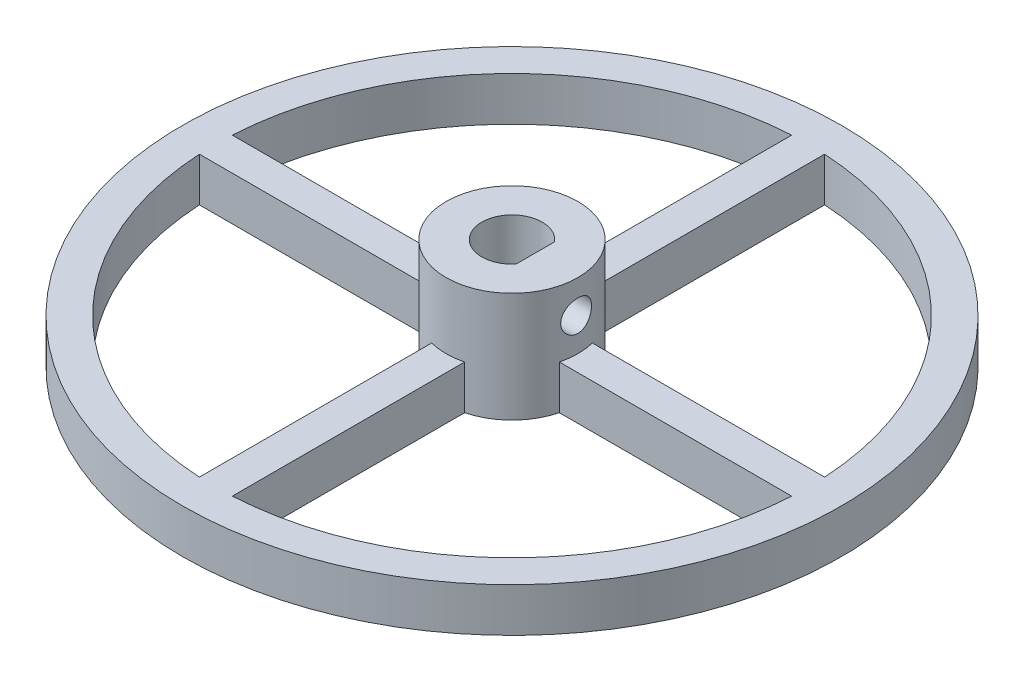
ISO-10303-21;
HEADER;
FILE_DESCRIPTION(('STEP AP214'),'2;1');
FILE_NAME('part.step','',(''),(''),'','','');
FILE_SCHEMA(('AUTOMOTIVE_DESIGN { 1 0 10303 214 1 1 1 1 }'));
ENDSEC;
DATA;
#1=APPLICATION_CONTEXT('core data for automotive mechanical design processes');
#2=APPLICATION_PROTOCOL_DEFINITION('international standard','automotive_design',2000,#1);
#3=PRODUCT_CONTEXT('',#1,'mechanical');
#4=PRODUCT('Part','Part','',(#3));
#5=PRODUCT_RELATED_PRODUCT_CATEGORY('part','',(#4));
#6=PRODUCT_DEFINITION_FORMATION('','',#4);
#7=PRODUCT_DEFINITION_CONTEXT('part definition',#1,'design');
#8=PRODUCT_DEFINITION('design','',#6,#7);
#9=PRODUCT_DEFINITION_SHAPE('','',#8);
#10=(LENGTH_UNIT() NAMED_UNIT(*) SI_UNIT(.MILLI.,.METRE.));
#11=(NAMED_UNIT(*) PLANE_ANGLE_UNIT() SI_UNIT($,.RADIAN.));
#12=(NAMED_UNIT(*) SI_UNIT($,.STERADIAN.) SOLID_ANGLE_UNIT());
#13=UNCERTAINTY_MEASURE_WITH_UNIT(LENGTH_MEASURE(1.E-05),#10,'distance_accuracy_value','');
#14=(GEOMETRIC_REPRESENTATION_CONTEXT(3) GLOBAL_UNCERTAINTY_ASSIGNED_CONTEXT((#13)) GLOBAL_UNIT_ASSIGNED_CONTEXT((#10,
#11,#12)) REPRESENTATION_CONTEXT('',''));
#15=CARTESIAN_POINT('',(0.,0.,0.));
#16=DIRECTION('',(0.,0.,1.));
#17=DIRECTION('',(1.,0.,0.));
#18=AXIS2_PLACEMENT_3D('',#15,#16,#17);
#19=CARTESIAN_POINT('',(0.,0.,0.));
#20=DIRECTION('',(0.,1.,0.));
#21=DIRECTION('',(0.,0.,1.));
#22=AXIS2_PLACEMENT_3D('',#19,#20,#21);
#23=PLANE('',#22);
#24=CARTESIAN_POINT('',(0.,0.,0.));
#25=DIRECTION('',(0.,-1.,0.));
#26=DIRECTION('',(0.,0.,-1.));
#27=AXIS2_PLACEMENT_3D('',#24,#25,#26);
#28=CIRCLE('',#27,6.);
#29=CARTESIAN_POINT('',(1.5,0.,-5.80947501931113));
#30=VERTEX_POINT('',#29);
#31=CARTESIAN_POINT('',(5.80947501931113,0.,-1.5));
#32=VERTEX_POINT('',#31);
#33=EDGE_CURVE('E62',#30,#32,#28,.T.);
#34=ORIENTED_EDGE('',*,*,#33,.T.);
#35=DIRECTION('',(-1.,0.,0.));
#36=VECTOR('',#35,1.);
#37=CARTESIAN_POINT('',(0.,0.,-1.5));
#38=LINE('',#37,#36);
#39=CARTESIAN_POINT('',(26.9583011334171,0.,-1.5));
#40=VERTEX_POINT('',#39);
#41=EDGE_CURVE('E219',#40,#32,#38,.T.);
#42=ORIENTED_EDGE('',*,*,#41,.F.);
#43=CARTESIAN_POINT('',(0.,0.,0.));
#44=DIRECTION('',(0.,-1.,0.));
#45=DIRECTION('',(0.,0.,-1.));
#46=AXIS2_PLACEMENT_3D('',#43,#44,#45);
#47=CIRCLE('',#46,27.);
#48=CARTESIAN_POINT('',(1.5,0.,-26.9583011334171));
#49=VERTEX_POINT('',#48);
#50=EDGE_CURVE('E215',#49,#40,#47,.T.);
#51=ORIENTED_EDGE('',*,*,#50,.F.);
#52=DIRECTION('',(0.,0.,1.));
#53=VECTOR('',#52,1.);
#54=CARTESIAN_POINT('',(1.5,0.,0.));
#55=LINE('',#54,#53);
#56=EDGE_CURVE('E210',#49,#30,#55,.T.);
#57=ORIENTED_EDGE('',*,*,#56,.T.);
#58=EDGE_LOOP('',(#34,#42,#51,#57));
#59=FACE_BOUND('',#58,.T.);
#60=CARTESIAN_POINT('',(0.,0.,0.));
#61=DIRECTION('',(0.,-1.,0.));
#62=DIRECTION('',(0.,0.,-1.));
#63=AXIS2_PLACEMENT_3D('',#60,#61,#62);
#64=CIRCLE('',#63,6.);
#65=CARTESIAN_POINT('',(-1.5,0.,5.80947501931112));
#66=VERTEX_POINT('',#65);
#67=CARTESIAN_POINT('',(-5.80947501931113,0.,1.5));
#68=VERTEX_POINT('',#67);
#69=EDGE_CURVE('E203',#66,#68,#64,.T.);
#70=ORIENTED_EDGE('',*,*,#69,.T.);
#71=DIRECTION('',(1.,0.,0.));
#72=VECTOR('',#71,1.);
#73=CARTESIAN_POINT('',(0.,0.,1.5));
#74=LINE('',#73,#72);
#75=CARTESIAN_POINT('',(-26.9583011334171,0.,1.5));
#76=VERTEX_POINT('',#75);
#77=EDGE_CURVE('E271',#76,#68,#74,.T.);
#78=ORIENTED_EDGE('',*,*,#77,.F.);
#79=CARTESIAN_POINT('',(0.,0.,0.));
#80=DIRECTION('',(0.,-1.,0.));
#81=DIRECTION('',(0.,0.,-1.));
#82=AXIS2_PLACEMENT_3D('',#79,#80,#81);
#83=CIRCLE('',#82,27.);
#84=CARTESIAN_POINT('',(-1.5,0.,26.9583011334171));
#85=VERTEX_POINT('',#84);
#86=EDGE_CURVE('E267',#85,#76,#83,.T.);
#87=ORIENTED_EDGE('',*,*,#86,.F.);
#88=DIRECTION('',(0.,0.,-1.));
#89=VECTOR('',#88,1.);
#90=CARTESIAN_POINT('',(-1.5,0.,0.));
#91=LINE('',#90,#89);
#92=EDGE_CURVE('E263',#85,#66,#91,.T.);
#93=ORIENTED_EDGE('',*,*,#92,.T.);
#94=EDGE_LOOP('',(#70,#78,#87,#93));
#95=FACE_BOUND('',#94,.T.);
#96=CARTESIAN_POINT('',(0.,0.,0.));
#97=DIRECTION('',(0.,1.,0.));
#98=DIRECTION('',(0.,0.,1.));
#99=AXIS2_PLACEMENT_3D('',#96,#97,#98);
#100=CIRCLE('',#99,30.);
#101=CARTESIAN_POINT('',(0.,0.,30.));
#102=VERTEX_POINT('',#101);
#103=EDGE_CURVE('E386',#102,#102,#100,.T.);
#104=ORIENTED_EDGE('',*,*,#103,.F.);
#105=EDGE_LOOP('',(#104));
#106=FACE_BOUND('',#105,.T.);
#107=DIRECTION('',(0.,0.,1.));
#108=VECTOR('',#107,1.);
#109=CARTESIAN_POINT('',(2.12132034355964,0.,0.));
#110=LINE('',#109,#108);
#111=CARTESIAN_POINT('',(2.12132034355964,0.,-1.75));
#112=VERTEX_POINT('',#111);
#113=CARTESIAN_POINT('',(2.12132034355964,0.,1.75));
#114=VERTEX_POINT('',#113);
#115=EDGE_CURVE('E329',#112,#114,#110,.T.);
#116=ORIENTED_EDGE('',*,*,#115,.F.);
#117=CARTESIAN_POINT('',(0.,0.,0.));
#118=DIRECTION('',(0.,1.,0.));
#119=DIRECTION('',(0.,0.,1.));
#120=AXIS2_PLACEMENT_3D('',#117,#118,#119);
#121=CIRCLE('',#120,2.75);
#122=EDGE_CURVE('E375',#112,#114,#121,.T.);
#123=ORIENTED_EDGE('',*,*,#122,.T.);
#124=EDGE_LOOP('',(#116,#123));
#125=FACE_BOUND('',#124,.T.);
#126=CARTESIAN_POINT('',(0.,0.,0.));
#127=DIRECTION('',(0.,-1.,0.));
#128=DIRECTION('',(0.,0.,-1.));
#129=AXIS2_PLACEMENT_3D('',#126,#127,#128);
#130=CIRCLE('',#129,6.);
#131=CARTESIAN_POINT('',(5.80947501931113,0.,1.5));
#132=VERTEX_POINT('',#131);
#133=CARTESIAN_POINT('',(1.5,0.,5.80947501931112));
#134=VERTEX_POINT('',#133);
#135=EDGE_CURVE('E189',#132,#134,#130,.T.);
#136=ORIENTED_EDGE('',*,*,#135,.T.);
#137=DIRECTION('',(0.,0.,-1.));
#138=VECTOR('',#137,1.);
#139=CARTESIAN_POINT('',(1.5,0.,0.));
#140=LINE('',#139,#138);
#141=CARTESIAN_POINT('',(1.5,0.,26.9583011334171));
#142=VERTEX_POINT('',#141);
#143=EDGE_CURVE('E193',#142,#134,#140,.T.);
#144=ORIENTED_EDGE('',*,*,#143,.F.);
#145=CARTESIAN_POINT('',(0.,0.,0.));
#146=DIRECTION('',(0.,-1.,0.));
#147=DIRECTION('',(0.,0.,-1.));
#148=AXIS2_PLACEMENT_3D('',#145,#146,#147);
#149=CIRCLE('',#148,27.);
#150=CARTESIAN_POINT('',(26.9583011334171,0.,1.5));
#151=VERTEX_POINT('',#150);
#152=EDGE_CURVE('E171',#151,#142,#149,.T.);
#153=ORIENTED_EDGE('',*,*,#152,.F.);
#154=DIRECTION('',(-1.,0.,0.));
#155=VECTOR('',#154,1.);
#156=CARTESIAN_POINT('',(0.,0.,1.5));
#157=LINE('',#156,#155);
#158=EDGE_CURVE('E183',#151,#132,#157,.T.);
#159=ORIENTED_EDGE('',*,*,#158,.T.);
#160=EDGE_LOOP('',(#136,#144,#153,#159));
#161=FACE_BOUND('',#160,.T.);
#162=CARTESIAN_POINT('',(0.,0.,0.));
#163=DIRECTION('',(0.,-1.,0.));
#164=DIRECTION('',(0.,0.,-1.));
#165=AXIS2_PLACEMENT_3D('',#162,#163,#164);
#166=CIRCLE('',#165,6.);
#167=CARTESIAN_POINT('',(-5.80947501931113,0.,-1.5));
#168=VERTEX_POINT('',#167);
#169=CARTESIAN_POINT('',(-1.5,0.,-5.80947501931113));
#170=VERTEX_POINT('',#169);
#171=EDGE_CURVE('E55',#168,#170,#166,.T.);
#172=ORIENTED_EDGE('',*,*,#171,.T.);
#173=DIRECTION('',(0.,0.,1.));
#174=VECTOR('',#173,1.);
#175=CARTESIAN_POINT('',(-1.5,0.,0.));
#176=LINE('',#175,#174);
#177=CARTESIAN_POINT('',(-1.5,0.,-26.9583011334171));
#178=VERTEX_POINT('',#177);
#179=EDGE_CURVE('E245',#178,#170,#176,.T.);
#180=ORIENTED_EDGE('',*,*,#179,.F.);
#181=CARTESIAN_POINT('',(0.,0.,0.));
#182=DIRECTION('',(0.,-1.,0.));
#183=DIRECTION('',(0.,0.,-1.));
#184=AXIS2_PLACEMENT_3D('',#181,#182,#183);
#185=CIRCLE('',#184,27.);
#186=CARTESIAN_POINT('',(-26.9583011334171,0.,-1.5));
#187=VERTEX_POINT('',#186);
#188=EDGE_CURVE('E241',#187,#178,#185,.T.);
#189=ORIENTED_EDGE('',*,*,#188,.F.);
#190=DIRECTION('',(1.,0.,0.));
#191=VECTOR('',#190,1.);
#192=CARTESIAN_POINT('',(0.,0.,-1.5));
#193=LINE('',#192,#191);
#194=EDGE_CURVE('E237',#187,#168,#193,.T.);
#195=ORIENTED_EDGE('',*,*,#194,.T.);
#196=EDGE_LOOP('',(#172,#180,#189,#195));
#197=FACE_BOUND('',#196,.T.);
#198=ADVANCED_FACE('F39',(#59,#95,#106,#125,#161,#197),#23,.F.);
#199=CARTESIAN_POINT('',(0.,10.,0.));
#200=DIRECTION('',(0.,1.,0.));
#201=DIRECTION('',(0.,0.,1.));
#202=AXIS2_PLACEMENT_3D('',#199,#200,#201);
#203=PLANE('',#202);
#204=CARTESIAN_POINT('',(0.,10.,0.));
#205=DIRECTION('',(0.,1.,0.));
#206=DIRECTION('',(0.,0.,1.));
#207=AXIS2_PLACEMENT_3D('',#204,#205,#206);
#208=CIRCLE('',#207,6.);
#209=CARTESIAN_POINT('',(0.,10.,6.));
#210=VERTEX_POINT('',#209);
#211=EDGE_CURVE('E364',#210,#210,#208,.T.);
#212=ORIENTED_EDGE('',*,*,#211,.T.);
#213=EDGE_LOOP('',(#212));
#214=FACE_BOUND('',#213,.T.);
#215=CARTESIAN_POINT('',(0.,10.,0.));
#216=DIRECTION('',(0.,1.,0.));
#217=DIRECTION('',(0.,0.,1.));
#218=AXIS2_PLACEMENT_3D('',#215,#216,#217);
#219=CIRCLE('',#218,2.75);
#220=CARTESIAN_POINT('',(2.12132034355964,10.,-1.75));
#221=VERTEX_POINT('',#220);
#222=CARTESIAN_POINT('',(2.12132034355964,10.,1.75));
#223=VERTEX_POINT('',#222);
#224=EDGE_CURVE('E368',#221,#223,#219,.T.);
#225=ORIENTED_EDGE('',*,*,#224,.F.);
#226=DIRECTION('',(0.,0.,1.));
#227=VECTOR('',#226,1.);
#228=CARTESIAN_POINT('',(2.12132034355964,10.,0.));
#229=LINE('',#228,#227);
#230=EDGE_CURVE('E328',#221,#223,#229,.T.);
#231=ORIENTED_EDGE('',*,*,#230,.T.);
#232=EDGE_LOOP('',(#225,#231));
#233=FACE_BOUND('',#232,.T.);
#234=ADVANCED_FACE('F351',(#214,#233),#203,.T.);
#235=CARTESIAN_POINT('',(0.,4.,0.));
#236=DIRECTION('',(0.,-1.,0.));
#237=DIRECTION('',(0.,0.,-1.));
#238=AXIS2_PLACEMENT_3D('',#235,#236,#237);
#239=CYLINDRICAL_SURFACE('',#238,30.);
#240=CARTESIAN_POINT('',(0.,4.,0.));
#241=DIRECTION('',(0.,1.,0.));
#242=DIRECTION('',(0.,0.,1.));
#243=AXIS2_PLACEMENT_3D('',#240,#241,#242);
#244=CIRCLE('',#243,30.);
#245=CARTESIAN_POINT('',(0.,4.,30.));
#246=VERTEX_POINT('',#245);
#247=EDGE_CURVE('E392',#246,#246,#244,.T.);
#248=ORIENTED_EDGE('',*,*,#247,.F.);
#249=EDGE_LOOP('',(#248));
#250=FACE_BOUND('',#249,.T.);
#251=ORIENTED_EDGE('',*,*,#103,.T.);
#252=EDGE_LOOP('',(#251));
#253=FACE_BOUND('',#252,.T.);
#254=ADVANCED_FACE('F41',(#250,#253),#239,.T.);
#255=CARTESIAN_POINT('',(0.,4.,0.));
#256=DIRECTION('',(0.,1.,0.));
#257=DIRECTION('',(0.,0.,1.));
#258=AXIS2_PLACEMENT_3D('',#255,#256,#257);
#259=PLANE('',#258);
#260=DIRECTION('',(0.,0.,-1.));
#261=VECTOR('',#260,1.);
#262=CARTESIAN_POINT('',(-1.5,4.,0.));
#263=LINE('',#262,#261);
#264=CARTESIAN_POINT('',(-1.5,4.,-5.80947501931113));
#265=VERTEX_POINT('',#264);
#266=CARTESIAN_POINT('',(-1.5,4.,-26.9583011334171));
#267=VERTEX_POINT('',#266);
#268=EDGE_CURVE('E312',#265,#267,#263,.T.);
#269=ORIENTED_EDGE('',*,*,#268,.F.);
#270=CARTESIAN_POINT('',(0.,4.,0.));
#271=DIRECTION('',(0.,1.,0.));
#272=DIRECTION('',(0.,0.,1.));
#273=AXIS2_PLACEMENT_3D('',#270,#271,#272);
#274=CIRCLE('',#273,6.);
#275=CARTESIAN_POINT('',(1.5,4.,-5.80947501931113));
#276=VERTEX_POINT('',#275);
#277=EDGE_CURVE('E418',#276,#265,#274,.T.);
#278=ORIENTED_EDGE('',*,*,#277,.F.);
#279=DIRECTION('',(0.,0.,-1.));
#280=VECTOR('',#279,1.);
#281=CARTESIAN_POINT('',(1.5,4.,0.));
#282=LINE('',#281,#280);
#283=CARTESIAN_POINT('',(1.5,4.,-26.9583011334171));
#284=VERTEX_POINT('',#283);
#285=EDGE_CURVE('E301',#276,#284,#282,.T.);
#286=ORIENTED_EDGE('',*,*,#285,.T.);
#287=CARTESIAN_POINT('',(0.,4.,0.));
#288=DIRECTION('',(0.,1.,0.));
#289=DIRECTION('',(0.,0.,1.));
#290=AXIS2_PLACEMENT_3D('',#287,#288,#289);
#291=CIRCLE('',#290,27.);
#292=CARTESIAN_POINT('',(26.9583011334171,4.,-1.5));
#293=VERTEX_POINT('',#292);
#294=EDGE_CURVE('E48',#293,#284,#291,.T.);
#295=ORIENTED_EDGE('',*,*,#294,.F.);
#296=DIRECTION('',(1.,0.,0.));
#297=VECTOR('',#296,1.);
#298=CARTESIAN_POINT('',(0.,4.,-1.5));
#299=LINE('',#298,#297);
#300=CARTESIAN_POINT('',(5.80947501931113,4.,-1.5));
#301=VERTEX_POINT('',#300);
#302=EDGE_CURVE('E305',#301,#293,#299,.T.);
#303=ORIENTED_EDGE('',*,*,#302,.F.);
#304=CARTESIAN_POINT('',(5.80947501931113,4.,1.5));
#305=VERTEX_POINT('',#304);
#306=EDGE_CURVE('E393',#305,#301,#274,.T.);
#307=ORIENTED_EDGE('',*,*,#306,.F.);
#308=DIRECTION('',(1.,0.,0.));
#309=VECTOR('',#308,1.);
#310=CARTESIAN_POINT('',(0.,4.,1.5));
#311=LINE('',#310,#309);
#312=CARTESIAN_POINT('',(26.9583011334171,4.,1.5));
#313=VERTEX_POINT('',#312);
#314=EDGE_CURVE('E295',#305,#313,#311,.T.);
#315=ORIENTED_EDGE('',*,*,#314,.T.);
#316=CARTESIAN_POINT('',(0.,4.,0.));
#317=DIRECTION('',(0.,1.,0.));
#318=DIRECTION('',(0.,0.,1.));
#319=AXIS2_PLACEMENT_3D('',#316,#317,#318);
#320=CIRCLE('',#319,27.);
#321=CARTESIAN_POINT('',(1.5,4.,26.9583011334171));
#322=VERTEX_POINT('',#321);
#323=EDGE_CURVE('E174',#322,#313,#320,.T.);
#324=ORIENTED_EDGE('',*,*,#323,.F.);
#325=DIRECTION('',(0.,0.,1.));
#326=VECTOR('',#325,1.);
#327=CARTESIAN_POINT('',(1.5,4.,0.));
#328=LINE('',#327,#326);
#329=CARTESIAN_POINT('',(1.5,4.,5.80947501931112));
#330=VERTEX_POINT('',#329);
#331=EDGE_CURVE('E298',#330,#322,#328,.T.);
#332=ORIENTED_EDGE('',*,*,#331,.F.);
#333=CARTESIAN_POINT('',(-1.5,4.,5.80947501931112));
#334=VERTEX_POINT('',#333);
#335=EDGE_CURVE('E387',#334,#330,#274,.T.);
#336=ORIENTED_EDGE('',*,*,#335,.F.);
#337=DIRECTION('',(0.,0.,1.));
#338=VECTOR('',#337,1.);
#339=CARTESIAN_POINT('',(-1.5,4.,0.));
#340=LINE('',#339,#338);
#341=CARTESIAN_POINT('',(-1.5,4.,26.9583011334171));
#342=VERTEX_POINT('',#341);
#343=EDGE_CURVE('E279',#334,#342,#340,.T.);
#344=ORIENTED_EDGE('',*,*,#343,.T.);
#345=CARTESIAN_POINT('',(0.,4.,0.));
#346=DIRECTION('',(0.,1.,0.));
#347=DIRECTION('',(0.,0.,1.));
#348=AXIS2_PLACEMENT_3D('',#345,#346,#347);
#349=CIRCLE('',#348,27.);
#350=CARTESIAN_POINT('',(-26.9583011334171,4.,1.5));
#351=VERTEX_POINT('',#350);
#352=EDGE_CURVE('E400',#351,#342,#349,.T.);
#353=ORIENTED_EDGE('',*,*,#352,.F.);
#354=DIRECTION('',(-1.,0.,0.));
#355=VECTOR('',#354,1.);
#356=CARTESIAN_POINT('',(0.,4.,1.5));
#357=LINE('',#356,#355);
#358=CARTESIAN_POINT('',(-5.80947501931113,4.,1.5));
#359=VERTEX_POINT('',#358);
#360=EDGE_CURVE('E292',#359,#351,#357,.T.);
#361=ORIENTED_EDGE('',*,*,#360,.F.);
#362=CARTESIAN_POINT('',(-5.80947501931113,4.,-1.5));
#363=VERTEX_POINT('',#362);
#364=EDGE_CURVE('E391',#363,#359,#274,.T.);
#365=ORIENTED_EDGE('',*,*,#364,.F.);
#366=DIRECTION('',(-1.,0.,0.));
#367=VECTOR('',#366,1.);
#368=CARTESIAN_POINT('',(0.,4.,-1.5));
#369=LINE('',#368,#367);
#370=CARTESIAN_POINT('',(-26.9583011334171,4.,-1.5));
#371=VERTEX_POINT('',#370);
#372=EDGE_CURVE('E308',#363,#371,#369,.T.);
#373=ORIENTED_EDGE('',*,*,#372,.T.);
#374=CARTESIAN_POINT('',(0.,4.,0.));
#375=DIRECTION('',(0.,1.,0.));
#376=DIRECTION('',(0.,0.,1.));
#377=AXIS2_PLACEMENT_3D('',#374,#375,#376);
#378=CIRCLE('',#377,27.);
#379=EDGE_CURVE('E11',#267,#371,#378,.T.);
#380=ORIENTED_EDGE('',*,*,#379,.F.);
#381=EDGE_LOOP('',(#269,#278,#286,#295,#303,#307,#315,#324,#332,#336,#344,#353,#361,#365,#373,#380));
#382=FACE_BOUND('',#381,.T.);
#383=ORIENTED_EDGE('',*,*,#247,.T.);
#384=EDGE_LOOP('',(#383));
#385=FACE_BOUND('',#384,.T.);
#386=ADVANCED_FACE('F358',(#382,#385),#259,.T.);
#387=CARTESIAN_POINT('',(0.,10.,0.));
#388=DIRECTION('',(0.,-1.,0.));
#389=DIRECTION('',(0.,0.,-1.));
#390=AXIS2_PLACEMENT_3D('',#387,#388,#389);
#391=CYLINDRICAL_SURFACE('',#390,6.);
#392=ORIENTED_EDGE('',*,*,#211,.F.);
#393=EDGE_LOOP('',(#392));
#394=FACE_BOUND('',#393,.T.);
#395=ORIENTED_EDGE('',*,*,#335,.T.);
#396=DIRECTION('',(0.,-1.,0.));
#397=VECTOR('',#396,1.);
#398=CARTESIAN_POINT('',(1.5,10.,5.80947501931112));
#399=LINE('',#398,#397);
#400=EDGE_CURVE('E200',#330,#134,#399,.T.);
#401=ORIENTED_EDGE('',*,*,#400,.T.);
#402=ORIENTED_EDGE('',*,*,#135,.F.);
#403=DIRECTION('',(0.,-1.,0.));
#404=VECTOR('',#403,1.);
#405=CARTESIAN_POINT('',(5.80947501931113,10.,1.5));
#406=LINE('',#405,#404);
#407=EDGE_CURVE('E179',#305,#132,#406,.T.);
#408=ORIENTED_EDGE('',*,*,#407,.F.);
#409=ORIENTED_EDGE('',*,*,#306,.T.);
#410=DIRECTION('',(0.,-1.,0.));
#411=VECTOR('',#410,1.);
#412=CARTESIAN_POINT('',(5.80947501931113,10.,-1.5));
#413=LINE('',#412,#411);
#414=EDGE_CURVE('E224',#301,#32,#413,.T.);
#415=ORIENTED_EDGE('',*,*,#414,.T.);
#416=ORIENTED_EDGE('',*,*,#33,.F.);
#417=DIRECTION('',(0.,-1.,0.));
#418=VECTOR('',#417,1.);
#419=CARTESIAN_POINT('',(1.5,10.,-5.80947501931113));
#420=LINE('',#419,#418);
#421=EDGE_CURVE('E223',#276,#30,#420,.T.);
#422=ORIENTED_EDGE('',*,*,#421,.F.);
#423=ORIENTED_EDGE('',*,*,#277,.T.);
#424=DIRECTION('',(0.,-1.,0.));
#425=VECTOR('',#424,1.);
#426=CARTESIAN_POINT('',(-1.5,10.,-5.80947501931113));
#427=LINE('',#426,#425);
#428=EDGE_CURVE('E211',#265,#170,#427,.T.);
#429=ORIENTED_EDGE('',*,*,#428,.T.);
#430=ORIENTED_EDGE('',*,*,#171,.F.);
#431=DIRECTION('',(0.,-1.,0.));
#432=VECTOR('',#431,1.);
#433=CARTESIAN_POINT('',(-5.80947501931113,10.,-1.5));
#434=LINE('',#433,#432);
#435=EDGE_CURVE('E249',#363,#168,#434,.T.);
#436=ORIENTED_EDGE('',*,*,#435,.F.);
#437=ORIENTED_EDGE('',*,*,#364,.T.);
#438=DIRECTION('',(0.,-1.,0.));
#439=VECTOR('',#438,1.);
#440=CARTESIAN_POINT('',(-5.80947501931113,10.,1.5));
#441=LINE('',#440,#439);
#442=EDGE_CURVE('E276',#359,#68,#441,.T.);
#443=ORIENTED_EDGE('',*,*,#442,.T.);
#444=ORIENTED_EDGE('',*,*,#69,.F.);
#445=DIRECTION('',(0.,-1.,0.));
#446=VECTOR('',#445,1.);
#447=CARTESIAN_POINT('',(-1.5,10.,5.80947501931112));
#448=LINE('',#447,#446);
#449=EDGE_CURVE('E275',#334,#66,#448,.T.);
#450=ORIENTED_EDGE('',*,*,#449,.F.);
#451=EDGE_LOOP('',(#395,#401,#402,#408,#409,#415,#416,#422,#423,#429,#430,#436,#437,#443,#444,#450));
#452=FACE_BOUND('',#451,.T.);
#453=CARTESIAN_POINT('',(5.83438085832593,7.,1.4));
#454=CARTESIAN_POINT('',(5.83438240713305,7.07748127009628,1.39999752897121));
#455=CARTESIAN_POINT('',(5.83594113113471,7.15499113191502,1.39354594762189));
#456=CARTESIAN_POINT('',(5.84199416300749,7.30779688786216,1.36794409538363));
#457=CARTESIAN_POINT('',(5.84649040504597,7.38309128909227,1.34878545758606));
#458=CARTESIAN_POINT('',(5.85788215378785,7.52923375884606,1.29841363127606));
#459=CARTESIAN_POINT('',(5.86477481840199,7.60008697752087,1.26721471739009));
#460=CARTESIAN_POINT('',(5.88017931416204,7.73555802594805,1.19369008059532));
#461=CARTESIAN_POINT('',(5.88869115868398,7.80017580418284,1.15136426576614));
#462=CARTESIAN_POINT('',(5.90655766331575,7.92258246312702,1.05592042422923));
#463=CARTESIAN_POINT('',(5.91592434176156,7.98023411003338,1.00262861273496));
#464=CARTESIAN_POINT('',(5.93434035204426,8.08586688279051,0.88714033810609));
#465=CARTESIAN_POINT('',(5.94338965698452,8.13384719064705,0.824943122519717));
#466=CARTESIAN_POINT('',(5.96028315816151,8.21932659709147,0.692480344845558));
#467=CARTESIAN_POINT('',(5.96811151728704,8.25669241741223,0.622126583128503));
#468=CARTESIAN_POINT('',(5.98154471284947,8.31901797306193,0.475924410658288));
#469=CARTESIAN_POINT('',(5.98714983396844,8.34397929687038,0.400076704867756));
#470=CARTESIAN_POINT('',(5.99542006442471,8.38035207007692,0.246468422948655));
#471=CARTESIAN_POINT('',(5.99813559050782,8.39199615381926,0.168765692836242));
#472=CARTESIAN_POINT('',(6.00049580147819,8.40213256194694,0.0124654307432507));
#473=CARTESIAN_POINT('',(6.000140884059,8.40062658956885,-0.0661319840379758));
#474=CARTESIAN_POINT('',(5.99643827775144,8.38467621607323,-0.22038243403317));
#475=CARTESIAN_POINT('',(5.9931486277782,8.37048271968994,-0.296063014483886));
#476=CARTESIAN_POINT('',(5.98401294997535,8.32996158795322,-0.443937351340516));
#477=CARTESIAN_POINT('',(5.97816679666005,8.30363335696424,-0.516130936394457));
#478=CARTESIAN_POINT('',(5.96448369445457,8.23937681779177,-0.655662411374694));
#479=CARTESIAN_POINT('',(5.95663096457973,8.20135604592128,-0.722956109240958));
#480=CARTESIAN_POINT('',(5.93979166468828,8.11486315175258,-0.850298043438958));
#481=CARTESIAN_POINT('',(5.93080492066729,8.0663894247306,-0.910345165075966));
#482=CARTESIAN_POINT('',(5.91243116839085,7.95900986814144,-1.02298382065534));
#483=CARTESIAN_POINT('',(5.90303972002647,7.89988454653532,-1.0753655893591));
#484=CARTESIAN_POINT('',(5.88511193509137,7.77359071209639,-1.16951315096307));
#485=CARTESIAN_POINT('',(5.87657562866398,7.70642191591817,-1.21127856972193));
#486=CARTESIAN_POINT('',(5.86131086901547,7.56557629197206,-1.28311928066036));
#487=CARTESIAN_POINT('',(5.85458932713218,7.49187596565162,-1.31315007157412));
#488=CARTESIAN_POINT('',(5.84380727037895,7.34027963196071,-1.36033399651696));
#489=CARTESIAN_POINT('',(5.83974626809562,7.26238439593306,-1.3774894893968));
#490=CARTESIAN_POINT('',(5.83484585305818,7.10653908474137,-1.39810032473933));
#491=CARTESIAN_POINT('',(5.8339341319395,7.02863191027216,-1.40186322729132));
#492=CARTESIAN_POINT('',(5.83523964902541,6.87330328697474,-1.39641897695547));
#493=CARTESIAN_POINT('',(5.83745663986124,6.79588180023219,-1.38721284945225));
#494=CARTESIAN_POINT('',(5.84470103750626,6.64482497046983,-1.35636003740989));
#495=CARTESIAN_POINT('',(5.8496891723475,6.57115208493532,-1.33488707764707));
#496=CARTESIAN_POINT('',(5.86187755455804,6.42845039771518,-1.28030025935678));
#497=CARTESIAN_POINT('',(5.86907803707116,6.35942209063901,-1.24718516336753));
#498=CARTESIAN_POINT('',(5.88503566856558,6.22665057854113,-1.16959187555837));
#499=CARTESIAN_POINT('',(5.89381762819068,6.16301967278477,-1.12492673697715));
#500=CARTESIAN_POINT('',(5.91188538119269,6.04404319887724,-1.02574210184503));
#501=CARTESIAN_POINT('',(5.92117124609802,5.98869881119544,-0.971221203713207));
#502=CARTESIAN_POINT('',(5.93944192292914,5.88664918774636,-0.85247191256235));
#503=CARTESIAN_POINT('',(5.94841598440836,5.84015504719718,-0.788060164078878));
#504=CARTESIAN_POINT('',(5.96484373962347,5.75864582524921,-0.652162995697993));
#505=CARTESIAN_POINT('',(5.97229750893382,5.72363017319661,-0.580677927681216));
#506=CARTESIAN_POINT('',(5.98480005739952,5.66635408127874,-0.433135725189761));
#507=CARTESIAN_POINT('',(5.98986510691081,5.64400713336923,-0.35711361575605));
#508=CARTESIAN_POINT('',(5.99709029613555,5.61243681056742,-0.202261185265155));
#509=CARTESIAN_POINT('',(5.9992509199578,5.60321124859157,-0.123431334450482));
#510=CARTESIAN_POINT('',(6.00040699871177,5.59825516605721,0.0328046344139625));
#511=CARTESIAN_POINT('',(5.99947597571806,5.60221118367551,0.11020042687764));
#512=CARTESIAN_POINT('',(5.99471338137433,5.62279722469367,0.263191681222008));
#513=CARTESIAN_POINT('',(5.99088187680089,5.63942695631198,0.338787184508676));
#514=CARTESIAN_POINT('',(5.98075700496624,5.68472970825951,0.485750585480168));
#515=CARTESIAN_POINT('',(5.97447387330707,5.71335269269399,0.557134657732927));
#516=CARTESIAN_POINT('',(5.96011229736764,5.78178262774409,0.694125881671261));
#517=CARTESIAN_POINT('',(5.95203365402622,5.82159081854802,0.759732391694802));
#518=CARTESIAN_POINT('',(5.93474308040959,5.91225344870422,0.884816433492554));
#519=CARTESIAN_POINT('',(5.92551069348074,5.96332490929113,0.944133846970398));
#520=CARTESIAN_POINT('',(5.90705477759142,6.07463390254468,1.05346330371257));
#521=CARTESIAN_POINT('',(5.89783125136838,6.13487368674433,1.10347305450114));
#522=CARTESIAN_POINT('',(5.88027451979457,6.26394663161854,1.19353045744998));
#523=CARTESIAN_POINT('',(5.87195754966424,6.33289976705906,1.23340953731452));
#524=CARTESIAN_POINT('',(5.85736566955804,6.47671240943205,1.30094971958484));
#525=CARTESIAN_POINT('',(5.85108913982645,6.55156717255043,1.32862051951041));
#526=CARTESIAN_POINT('',(5.84236938910376,6.68867500034257,1.36638441859385));
#527=CARTESIAN_POINT('',(5.8393947395838,6.75022122426246,1.37896464197831));
#528=CARTESIAN_POINT('',(5.83539990897484,6.87450543033199,1.39577316839126));
#529=CARTESIAN_POINT('',(5.83437960385543,6.93724333659756,1.40000200143237));
#530=CARTESIAN_POINT('',(5.83438085832593,7.,1.4));
#531=B_SPLINE_CURVE_WITH_KNOTS('',3,(#453,#454,#455,#456,#457,#458,#459,#460,#461,#462,#463,
#464,#465,#466,#467,#468,#469,#470,#471,#472,#473,#474,#475,#476,#477,#478,#479,#480,#481,#482,
#483,#484,#485,#486,#487,#488,#489,#490,#491,#492,#493,#494,#495,#496,#497,#498,#499,#500,#501,
#502,#503,#504,#505,#506,#507,#508,#509,#510,#511,#512,#513,#514,#515,#516,#517,#518,#519,#520,
#521,#522,#523,#524,#525,#526,#527,#528,#529,#530),.UNSPECIFIED.,.T.,.F.,(4,2,2,2,2,2,2,2,2,2,2,
2,2,2,2,2,2,2,2,2,2,2,2,2,2,2,2,2,2,2,2,2,2,2,2,2,2,2,4),(0.,0.232213611218948,
0.464580274520692,0.696672292323,0.928766227519193,1.16486909871888,1.40099193094167,
1.63996030370597,1.87889806706619,2.11359490303957,2.34826134079243,2.57838730313738,
2.80852456245816,3.04053068043832,3.27257244107759,3.51009871852548,3.74763336571324,
3.98606027106499,4.22444348415662,4.45731559480038,4.6901692946548,4.91980425978676,
5.14946364057931,5.3831023379425,5.61677428708265,5.85546531594788,6.09414447647271,
6.33117355760682,6.56816312590406,6.79955761512103,7.03094677720144,7.26138004633751,
7.49183887543995,7.72720146781136,7.96262195345586,8.20173528337683,8.44065833264115,
8.62875380868085,8.81683734704598),.UNSPECIFIED.);
#532=CARTESIAN_POINT('',(5.83438085832593,7.,1.4));
#533=VERTEX_POINT('',#532);
#534=EDGE_CURVE('E319',#533,#533,#531,.T.);
#535=ORIENTED_EDGE('',*,*,#534,.T.);
#536=EDGE_LOOP('',(#535));
#537=FACE_BOUND('',#536,.T.);
#538=ADVANCED_FACE('F331',(#394,#452,#537),#391,.T.);
#539=CARTESIAN_POINT('',(2.12132034355964,0.,0.));
#540=DIRECTION('',(-1.,0.,0.));
#541=DIRECTION('',(0.,0.,1.));
#542=AXIS2_PLACEMENT_3D('',#539,#540,#541);
#543=PLANE('',#542);
#544=CARTESIAN_POINT('',(2.12132034355964,7.,0.));
#545=DIRECTION('',(-1.,0.,0.));
#546=DIRECTION('',(0.,0.,1.));
#547=AXIS2_PLACEMENT_3D('',#544,#545,#546);
#548=CIRCLE('',#547,1.4);
#549=CARTESIAN_POINT('',(2.12132034355964,7.,1.4));
#550=VERTEX_POINT('',#549);
#551=EDGE_CURVE('E315',#550,#550,#548,.T.);
#552=ORIENTED_EDGE('',*,*,#551,.F.);
#553=EDGE_LOOP('',(#552));
#554=FACE_BOUND('',#553,.T.);
#555=ORIENTED_EDGE('',*,*,#230,.F.);
#556=DIRECTION('',(0.,1.,0.));
#557=VECTOR('',#556,1.);
#558=CARTESIAN_POINT('',(2.12132034355964,0.,-1.75));
#559=LINE('',#558,#557);
#560=EDGE_CURVE('E381',#112,#221,#559,.T.);
#561=ORIENTED_EDGE('',*,*,#560,.F.);
#562=ORIENTED_EDGE('',*,*,#115,.T.);
#563=DIRECTION('',(0.,1.,0.));
#564=VECTOR('',#563,1.);
#565=CARTESIAN_POINT('',(2.12132034355964,0.,1.75));
#566=LINE('',#565,#564);
#567=EDGE_CURVE('E378',#114,#223,#566,.T.);
#568=ORIENTED_EDGE('',*,*,#567,.T.);
#569=EDGE_LOOP('',(#555,#561,#562,#568));
#570=FACE_BOUND('',#569,.T.);
#571=ADVANCED_FACE('F347',(#554,#570),#543,.T.);
#572=CARTESIAN_POINT('',(0.,0.,0.));
#573=DIRECTION('',(0.,1.,0.));
#574=DIRECTION('',(0.,0.,1.));
#575=AXIS2_PLACEMENT_3D('',#572,#573,#574);
#576=CYLINDRICAL_SURFACE('',#575,2.75);
#577=ORIENTED_EDGE('',*,*,#224,.T.);
#578=ORIENTED_EDGE('',*,*,#567,.F.);
#579=ORIENTED_EDGE('',*,*,#122,.F.);
#580=ORIENTED_EDGE('',*,*,#560,.T.);
#581=EDGE_LOOP('',(#577,#578,#579,#580));
#582=FACE_BOUND('',#581,.T.);
#583=ADVANCED_FACE('F341',(#582),#576,.F.);
#584=CARTESIAN_POINT('',(7.12132034355964,7.,0.));
#585=DIRECTION('',(-1.,0.,0.));
#586=DIRECTION('',(0.,0.,1.));
#587=AXIS2_PLACEMENT_3D('',#584,#585,#586);
#588=CYLINDRICAL_SURFACE('',#587,1.4);
#589=ORIENTED_EDGE('',*,*,#551,.T.);
#590=EDGE_LOOP('',(#589));
#591=FACE_BOUND('',#590,.T.);
#592=ORIENTED_EDGE('',*,*,#534,.F.);
#593=EDGE_LOOP('',(#592));
#594=FACE_BOUND('',#593,.T.);
#595=ADVANCED_FACE('F335',(#591,#594),#588,.F.);
#596=CARTESIAN_POINT('',(0.,10.,1.5));
#597=DIRECTION('',(0.,0.,-1.));
#598=DIRECTION('',(-1.,0.,0.));
#599=AXIS2_PLACEMENT_3D('',#596,#597,#598);
#600=PLANE('',#599);
#601=ORIENTED_EDGE('',*,*,#360,.T.);
#602=DIRECTION('',(0.,-1.,0.));
#603=VECTOR('',#602,1.);
#604=CARTESIAN_POINT('',(-26.9583011334171,10.,1.5));
#605=LINE('',#604,#603);
#606=EDGE_CURVE('E280',#351,#76,#605,.T.);
#607=ORIENTED_EDGE('',*,*,#606,.T.);
#608=ORIENTED_EDGE('',*,*,#77,.T.);
#609=ORIENTED_EDGE('',*,*,#442,.F.);
#610=EDGE_LOOP('',(#601,#607,#608,#609));
#611=FACE_BOUND('',#610,.T.);
#612=ADVANCED_FACE('F340',(#611),#600,.F.);
#613=CARTESIAN_POINT('',(0.,10.,0.));
#614=DIRECTION('',(0.,-1.,0.));
#615=DIRECTION('',(0.,0.,-1.));
#616=AXIS2_PLACEMENT_3D('',#613,#614,#615);
#617=CYLINDRICAL_SURFACE('',#616,27.);
#618=ORIENTED_EDGE('',*,*,#352,.T.);
#619=DIRECTION('',(0.,-1.,0.));
#620=VECTOR('',#619,1.);
#621=CARTESIAN_POINT('',(-1.5,10.,26.9583011334171));
#622=LINE('',#621,#620);
#623=EDGE_CURVE('E283',#342,#85,#622,.T.);
#624=ORIENTED_EDGE('',*,*,#623,.T.);
#625=ORIENTED_EDGE('',*,*,#86,.T.);
#626=ORIENTED_EDGE('',*,*,#606,.F.);
#627=EDGE_LOOP('',(#618,#624,#625,#626));
#628=FACE_BOUND('',#627,.T.);
#629=ADVANCED_FACE('F434',(#628),#617,.F.);
#630=CARTESIAN_POINT('',(-1.5,10.,0.));
#631=DIRECTION('',(-1.,0.,0.));
#632=DIRECTION('',(0.,0.,1.));
#633=AXIS2_PLACEMENT_3D('',#630,#631,#632);
#634=PLANE('',#633);
#635=ORIENTED_EDGE('',*,*,#449,.T.);
#636=ORIENTED_EDGE('',*,*,#92,.F.);
#637=ORIENTED_EDGE('',*,*,#623,.F.);
#638=ORIENTED_EDGE('',*,*,#343,.F.);
#639=EDGE_LOOP('',(#635,#636,#637,#638));
#640=FACE_BOUND('',#639,.T.);
#641=ADVANCED_FACE('F343',(#640),#634,.T.);
#642=CARTESIAN_POINT('',(1.5,10.,0.));
#643=DIRECTION('',(-1.,0.,0.));
#644=DIRECTION('',(0.,0.,1.));
#645=AXIS2_PLACEMENT_3D('',#642,#643,#644);
#646=PLANE('',#645);
#647=ORIENTED_EDGE('',*,*,#331,.T.);
#648=DIRECTION('',(0.,-1.,0.));
#649=VECTOR('',#648,1.);
#650=CARTESIAN_POINT('',(1.5,10.,26.9583011334171));
#651=LINE('',#650,#649);
#652=EDGE_CURVE('E178',#322,#142,#651,.T.);
#653=ORIENTED_EDGE('',*,*,#652,.T.);
#654=ORIENTED_EDGE('',*,*,#143,.T.);
#655=ORIENTED_EDGE('',*,*,#400,.F.);
#656=EDGE_LOOP('',(#647,#653,#654,#655));
#657=FACE_BOUND('',#656,.T.);
#658=ADVANCED_FACE('F445',(#657),#646,.F.);
#659=CARTESIAN_POINT('',(0.,10.,0.));
#660=DIRECTION('',(0.,-1.,0.));
#661=DIRECTION('',(0.,0.,-1.));
#662=AXIS2_PLACEMENT_3D('',#659,#660,#661);
#663=CYLINDRICAL_SURFACE('',#662,27.);
#664=ORIENTED_EDGE('',*,*,#323,.T.);
#665=DIRECTION('',(0.,-1.,0.));
#666=VECTOR('',#665,1.);
#667=CARTESIAN_POINT('',(26.9583011334171,10.,1.5));
#668=LINE('',#667,#666);
#669=EDGE_CURVE('E166',#313,#151,#668,.T.);
#670=ORIENTED_EDGE('',*,*,#669,.T.);
#671=ORIENTED_EDGE('',*,*,#152,.T.);
#672=ORIENTED_EDGE('',*,*,#652,.F.);
#673=EDGE_LOOP('',(#664,#670,#671,#672));
#674=FACE_BOUND('',#673,.T.);
#675=ADVANCED_FACE('F168',(#674),#663,.F.);
#676=CARTESIAN_POINT('',(0.,10.,1.5));
#677=DIRECTION('',(0.,0.,1.));
#678=DIRECTION('',(1.,0.,0.));
#679=AXIS2_PLACEMENT_3D('',#676,#677,#678);
#680=PLANE('',#679);
#681=ORIENTED_EDGE('',*,*,#407,.T.);
#682=ORIENTED_EDGE('',*,*,#158,.F.);
#683=ORIENTED_EDGE('',*,*,#669,.F.);
#684=ORIENTED_EDGE('',*,*,#314,.F.);
#685=EDGE_LOOP('',(#681,#682,#683,#684));
#686=FACE_BOUND('',#685,.T.);
#687=ADVANCED_FACE('F184',(#686),#680,.T.);
#688=CARTESIAN_POINT('',(0.,10.,-1.5));
#689=DIRECTION('',(0.,0.,1.));
#690=DIRECTION('',(1.,0.,0.));
#691=AXIS2_PLACEMENT_3D('',#688,#689,#690);
#692=PLANE('',#691);
#693=ORIENTED_EDGE('',*,*,#302,.T.);
#694=DIRECTION('',(0.,-1.,0.));
#695=VECTOR('',#694,1.);
#696=CARTESIAN_POINT('',(26.9583011334171,10.,-1.5));
#697=LINE('',#696,#695);
#698=EDGE_CURVE('E227',#293,#40,#697,.T.);
#699=ORIENTED_EDGE('',*,*,#698,.T.);
#700=ORIENTED_EDGE('',*,*,#41,.T.);
#701=ORIENTED_EDGE('',*,*,#414,.F.);
#702=EDGE_LOOP('',(#693,#699,#700,#701));
#703=FACE_BOUND('',#702,.T.);
#704=ADVANCED_FACE('F450',(#703),#692,.F.);
#705=CARTESIAN_POINT('',(0.,10.,0.));
#706=DIRECTION('',(0.,-1.,0.));
#707=DIRECTION('',(0.,0.,-1.));
#708=AXIS2_PLACEMENT_3D('',#705,#706,#707);
#709=CYLINDRICAL_SURFACE('',#708,27.);
#710=ORIENTED_EDGE('',*,*,#294,.T.);
#711=DIRECTION('',(0.,-1.,0.));
#712=VECTOR('',#711,1.);
#713=CARTESIAN_POINT('',(1.5,10.,-26.9583011334171));
#714=LINE('',#713,#712);
#715=EDGE_CURVE('E230',#284,#49,#714,.T.);
#716=ORIENTED_EDGE('',*,*,#715,.T.);
#717=ORIENTED_EDGE('',*,*,#50,.T.);
#718=ORIENTED_EDGE('',*,*,#698,.F.);
#719=EDGE_LOOP('',(#710,#716,#717,#718));
#720=FACE_BOUND('',#719,.T.);
#721=ADVANCED_FACE('F410',(#720),#709,.F.);
#722=CARTESIAN_POINT('',(1.5,10.,0.));
#723=DIRECTION('',(1.,0.,0.));
#724=DIRECTION('',(0.,0.,-1.));
#725=AXIS2_PLACEMENT_3D('',#722,#723,#724);
#726=PLANE('',#725);
#727=ORIENTED_EDGE('',*,*,#421,.T.);
#728=ORIENTED_EDGE('',*,*,#56,.F.);
#729=ORIENTED_EDGE('',*,*,#715,.F.);
#730=ORIENTED_EDGE('',*,*,#285,.F.);
#731=EDGE_LOOP('',(#727,#728,#729,#730));
#732=FACE_BOUND('',#731,.T.);
#733=ADVANCED_FACE('F420',(#732),#726,.T.);
#734=CARTESIAN_POINT('',(-1.5,10.,0.));
#735=DIRECTION('',(1.,0.,0.));
#736=DIRECTION('',(0.,0.,-1.));
#737=AXIS2_PLACEMENT_3D('',#734,#735,#736);
#738=PLANE('',#737);
#739=ORIENTED_EDGE('',*,*,#268,.T.);
#740=DIRECTION('',(0.,-1.,0.));
#741=VECTOR('',#740,1.);
#742=CARTESIAN_POINT('',(-1.5,10.,-26.9583011334171));
#743=LINE('',#742,#741);
#744=EDGE_CURVE('E252',#267,#178,#743,.T.);
#745=ORIENTED_EDGE('',*,*,#744,.T.);
#746=ORIENTED_EDGE('',*,*,#179,.T.);
#747=ORIENTED_EDGE('',*,*,#428,.F.);
#748=EDGE_LOOP('',(#739,#745,#746,#747));
#749=FACE_BOUND('',#748,.T.);
#750=ADVANCED_FACE('F464',(#749),#738,.F.);
#751=CARTESIAN_POINT('',(0.,10.,0.));
#752=DIRECTION('',(0.,-1.,0.));
#753=DIRECTION('',(0.,0.,-1.));
#754=AXIS2_PLACEMENT_3D('',#751,#752,#753);
#755=CYLINDRICAL_SURFACE('',#754,27.);
#756=ORIENTED_EDGE('',*,*,#379,.T.);
#757=DIRECTION('',(0.,-1.,0.));
#758=VECTOR('',#757,1.);
#759=CARTESIAN_POINT('',(-26.9583011334171,10.,-1.5));
#760=LINE('',#759,#758);
#761=EDGE_CURVE('E255',#371,#187,#760,.T.);
#762=ORIENTED_EDGE('',*,*,#761,.T.);
#763=ORIENTED_EDGE('',*,*,#188,.T.);
#764=ORIENTED_EDGE('',*,*,#744,.F.);
#765=EDGE_LOOP('',(#756,#762,#763,#764));
#766=FACE_BOUND('',#765,.T.);
#767=ADVANCED_FACE('F467',(#766),#755,.F.);
#768=CARTESIAN_POINT('',(0.,10.,-1.5));
#769=DIRECTION('',(0.,0.,-1.));
#770=DIRECTION('',(-1.,0.,0.));
#771=AXIS2_PLACEMENT_3D('',#768,#769,#770);
#772=PLANE('',#771);
#773=ORIENTED_EDGE('',*,*,#435,.T.);
#774=ORIENTED_EDGE('',*,*,#194,.F.);
#775=ORIENTED_EDGE('',*,*,#761,.F.);
#776=ORIENTED_EDGE('',*,*,#372,.F.);
#777=EDGE_LOOP('',(#773,#774,#775,#776));
#778=FACE_BOUND('',#777,.T.);
#779=ADVANCED_FACE('F471',(#778),#772,.T.);
#780=CLOSED_SHELL('',(#198,#234,#254,#386,#538,#571,#583,#595,#612,#629,#641,#658,#675,#687,
#704,#721,#733,#750,#767,#779));
#781=MANIFOLD_SOLID_BREP('B2',#780);
#782=ADVANCED_BREP_SHAPE_REPRESENTATION('',(#18,#781),#14);
#783=SHAPE_DEFINITION_REPRESENTATION(#9,#782);
ENDSEC;
END-ISO-10303-21;
